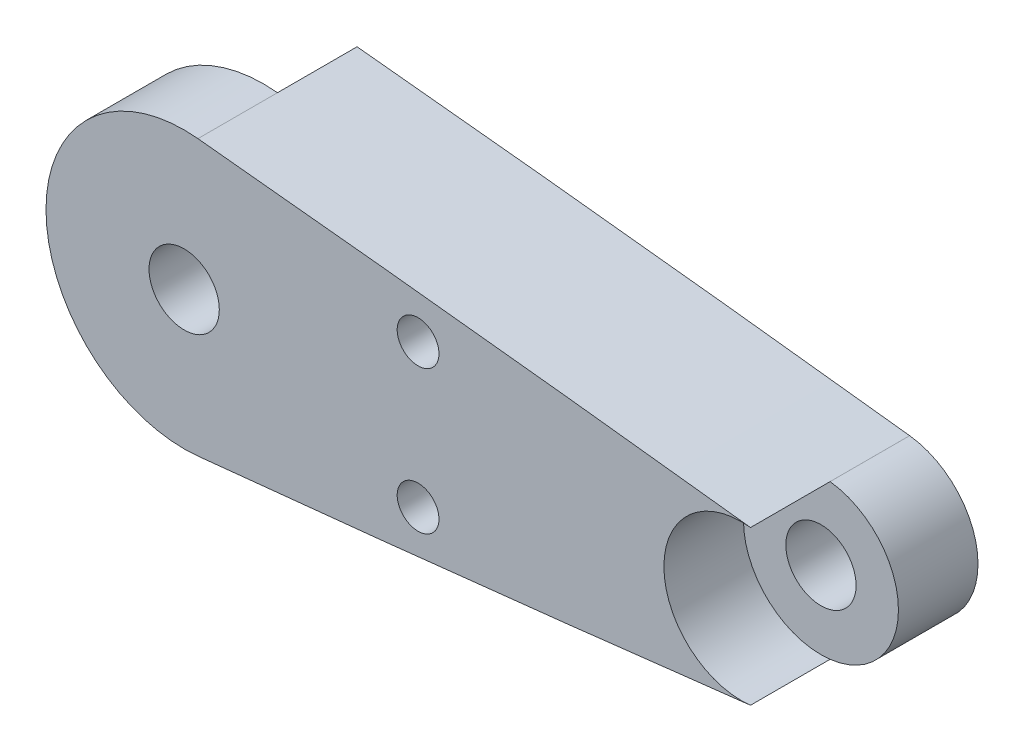
ISO-10303-21;
HEADER;
FILE_DESCRIPTION(('STEP AP214'),'2;1');
FILE_NAME('part.step','',(''),(''),'','','');
FILE_SCHEMA(('AUTOMOTIVE_DESIGN { 1 0 10303 214 1 1 1 1 }'));
ENDSEC;
DATA;
#1=APPLICATION_CONTEXT('core data for automotive mechanical design processes');
#2=APPLICATION_PROTOCOL_DEFINITION('international standard','automotive_design',2000,#1);
#3=PRODUCT_CONTEXT('',#1,'mechanical');
#4=PRODUCT('Part','Part','',(#3));
#5=PRODUCT_RELATED_PRODUCT_CATEGORY('part','',(#4));
#6=PRODUCT_DEFINITION_FORMATION('','',#4);
#7=PRODUCT_DEFINITION_CONTEXT('part definition',#1,'design');
#8=PRODUCT_DEFINITION('design','',#6,#7);
#9=PRODUCT_DEFINITION_SHAPE('','',#8);
#10=(LENGTH_UNIT() NAMED_UNIT(*) SI_UNIT(.MILLI.,.METRE.));
#11=(NAMED_UNIT(*) PLANE_ANGLE_UNIT() SI_UNIT($,.RADIAN.));
#12=(NAMED_UNIT(*) SI_UNIT($,.STERADIAN.) SOLID_ANGLE_UNIT());
#13=UNCERTAINTY_MEASURE_WITH_UNIT(LENGTH_MEASURE(1.E-05),#10,'distance_accuracy_value','');
#14=(GEOMETRIC_REPRESENTATION_CONTEXT(3) GLOBAL_UNCERTAINTY_ASSIGNED_CONTEXT((#13)) GLOBAL_UNIT_ASSIGNED_CONTEXT((#10,
#11,#12)) REPRESENTATION_CONTEXT('',''));
#15=CARTESIAN_POINT('',(0.,0.,0.));
#16=DIRECTION('',(0.,0.,1.));
#17=DIRECTION('',(1.,0.,0.));
#18=AXIS2_PLACEMENT_3D('',#15,#16,#17);
#19=CARTESIAN_POINT('',(215.289821858709,0.,12.));
#20=DIRECTION('',(0.,0.,-1.));
#21=DIRECTION('',(-1.,0.,0.));
#22=AXIS2_PLACEMENT_3D('',#19,#20,#21);
#23=CYLINDRICAL_SURFACE('',#22,2.65000000000001);
#24=CARTESIAN_POINT('',(215.289821858709,0.,12.));
#25=DIRECTION('',(0.,0.,1.));
#26=DIRECTION('',(1.,0.,0.));
#27=AXIS2_PLACEMENT_3D('',#24,#25,#26);
#28=CIRCLE('',#27,2.65000000000001);
#29=CARTESIAN_POINT('',(217.939821858709,0.,12.));
#30=VERTEX_POINT('',#29);
#31=EDGE_CURVE('E53',#30,#30,#28,.T.);
#32=ORIENTED_EDGE('',*,*,#31,.T.);
#33=EDGE_LOOP('',(#32));
#34=FACE_BOUND('',#33,.T.);
#35=CARTESIAN_POINT('',(215.289821858709,0.,6.));
#36=DIRECTION('',(0.,0.,1.));
#37=DIRECTION('',(1.,0.,0.));
#38=AXIS2_PLACEMENT_3D('',#35,#36,#37);
#39=CIRCLE('',#38,2.65000000000001);
#40=CARTESIAN_POINT('',(217.939821858709,0.,6.));
#41=VERTEX_POINT('',#40);
#42=EDGE_CURVE('E202',#41,#41,#39,.T.);
#43=ORIENTED_EDGE('',*,*,#42,.F.);
#44=EDGE_LOOP('',(#43));
#45=FACE_BOUND('',#44,.T.);
#46=ADVANCED_FACE('F44',(#34,#45),#23,.F.);
#47=CARTESIAN_POINT('',(215.289821858709,0.,12.));
#48=DIRECTION('',(0.,0.,-1.));
#49=DIRECTION('',(-1.,0.,0.));
#50=AXIS2_PLACEMENT_3D('',#47,#48,#49);
#51=CYLINDRICAL_SURFACE('',#50,10.4185907990476);
#52=DIRECTION('',(0.,0.,-1.));
#53=VECTOR('',#52,1.);
#54=CARTESIAN_POINT('',(216.328689217383,-10.3666672006523,12.));
#55=LINE('',#54,#53);
#56=CARTESIAN_POINT('',(216.328689217383,-10.3666672006523,12.));
#57=VERTEX_POINT('',#56);
#58=CARTESIAN_POINT('',(216.328689217383,-10.3666672006523,6.));
#59=VERTEX_POINT('',#58);
#60=EDGE_CURVE('E196',#57,#59,#55,.T.);
#61=ORIENTED_EDGE('',*,*,#60,.F.);
#62=CARTESIAN_POINT('',(215.289821858709,0.,12.));
#63=DIRECTION('',(0.,0.,1.));
#64=DIRECTION('',(1.,0.,0.));
#65=AXIS2_PLACEMENT_3D('',#62,#63,#64);
#66=CIRCLE('',#65,10.4185907990476);
#67=CARTESIAN_POINT('',(216.328689217383,10.3666672006523,12.));
#68=VERTEX_POINT('',#67);
#69=EDGE_CURVE('E11',#57,#68,#66,.F.);
#70=ORIENTED_EDGE('',*,*,#69,.T.);
#71=DIRECTION('',(0.,0.,-1.));
#72=VECTOR('',#71,1.);
#73=CARTESIAN_POINT('',(216.328689217383,10.3666672006523,12.));
#74=LINE('',#73,#72);
#75=CARTESIAN_POINT('',(216.328689217383,10.3666672006523,6.));
#76=VERTEX_POINT('',#75);
#77=EDGE_CURVE('E214',#68,#76,#74,.T.);
#78=ORIENTED_EDGE('',*,*,#77,.T.);
#79=CARTESIAN_POINT('',(215.289821858709,0.,6.));
#80=DIRECTION('',(0.,0.,1.));
#81=DIRECTION('',(1.,0.,0.));
#82=AXIS2_PLACEMENT_3D('',#79,#80,#81);
#83=CIRCLE('',#82,10.4185907990476);
#84=EDGE_CURVE('E47',#59,#76,#83,.F.);
#85=ORIENTED_EDGE('',*,*,#84,.F.);
#86=EDGE_LOOP('',(#61,#70,#78,#85));
#87=FACE_BOUND('',#86,.T.);
#88=ADVANCED_FACE('F183',(#87),#51,.T.);
#89=CARTESIAN_POINT('',(0.,0.,12.));
#90=DIRECTION('',(0.,0.,1.));
#91=DIRECTION('',(1.,0.,0.));
#92=AXIS2_PLACEMENT_3D('',#89,#90,#91);
#93=PLANE('',#92);
#94=CARTESIAN_POINT('',(232.929583796921,5.4,12.));
#95=DIRECTION('',(0.,0.,1.));
#96=DIRECTION('',(1.,0.,0.));
#97=AXIS2_PLACEMENT_3D('',#94,#95,#96);
#98=CIRCLE('',#97,1.57500000000001);
#99=CARTESIAN_POINT('',(234.504583796921,5.4,12.));
#100=VERTEX_POINT('',#99);
#101=EDGE_CURVE('E273',#100,#100,#98,.T.);
#102=ORIENTED_EDGE('',*,*,#101,.F.);
#103=EDGE_LOOP('',(#102));
#104=FACE_BOUND('',#103,.T.);
#105=CARTESIAN_POINT('',(232.929583796921,-5.4,12.));
#106=DIRECTION('',(0.,0.,1.));
#107=DIRECTION('',(1.,0.,0.));
#108=AXIS2_PLACEMENT_3D('',#105,#106,#107);
#109=CIRCLE('',#108,1.57500000000001);
#110=CARTESIAN_POINT('',(234.504583796921,-5.4,12.));
#111=VERTEX_POINT('',#110);
#112=EDGE_CURVE('E269',#111,#111,#109,.T.);
#113=ORIENTED_EDGE('',*,*,#112,.F.);
#114=EDGE_LOOP('',(#113));
#115=FACE_BOUND('',#114,.T.);
#116=ORIENTED_EDGE('',*,*,#31,.F.);
#117=EDGE_LOOP('',(#116));
#118=FACE_BOUND('',#117,.T.);
#119=ORIENTED_EDGE('',*,*,#69,.F.);
#120=CARTESIAN_POINT('',(300.,0.378,12.));
#121=CARTESIAN_POINT('',(299.845901447221,0.39961034336831,12.));
#122=CARTESIAN_POINT('',(299.230346714046,0.48593399083917,12.));
#123=CARTESIAN_POINT('',(297.848901683276,0.678531057447331,12.));
#124=CARTESIAN_POINT('',(295.556029122455,0.996787499241564,12.));
#125=CARTESIAN_POINT('',(292.365739581197,1.43343203295321,12.));
#126=CARTESIAN_POINT('',(288.297856433401,1.98344889126347,12.));
#127=CARTESIAN_POINT('',(283.377248038078,2.63572648359042,12.));
#128=CARTESIAN_POINT('',(277.63430498472,3.38149178862329,12.));
#129=CARTESIAN_POINT('',(271.104515413466,4.20901604095742,12.));
#130=CARTESIAN_POINT('',(263.828064626846,5.10718872872647,12.));
#131=CARTESIAN_POINT('',(255.849823781818,6.06276893212352,12.));
#132=CARTESIAN_POINT('',(247.21903434379,7.06424307195608,12.));
#133=CARTESIAN_POINT('',(237.988783489903,8.09787318806774,12.));
#134=CARTESIAN_POINT('',(228.216029511608,9.15107036010328,12.));
#135=CARTESIAN_POINT('',(217.961088379031,10.2107446574668,12.));
#136=CARTESIAN_POINT('',(207.287161839572,11.2632209265187,12.));
#137=CARTESIAN_POINT('',(196.260086850424,12.2937248064858,12.));
#138=CARTESIAN_POINT('',(184.947773044503,13.2887281219597,12.));
#139=CARTESIAN_POINT('',(173.420088229148,14.2315961384787,12.));
#140=CARTESIAN_POINT('',(161.747864995533,15.1069553720124,12.));
#141=CARTESIAN_POINT('',(150.00317252135,15.8985540753976,12.));
#142=CARTESIAN_POINT('',(138.258374542497,16.5898406039741,12.));
#143=CARTESIAN_POINT('',(126.585774705795,17.1633504747405,12.));
#144=CARTESIAN_POINT('',(115.057462615139,17.6037905135667,12.));
#145=CARTESIAN_POINT('',(103.744181572864,17.8967919128621,12.));
#146=CARTESIAN_POINT('',(92.7158453472272,18.0280433746414,12.));
#147=CARTESIAN_POINT('',(82.0402185013839,17.9871287273908,12.));
#148=CARTESIAN_POINT('',(71.7831190583338,17.7661449762132,12.));
#149=CARTESIAN_POINT('',(62.0076841473254,17.3594904245971,12.));
#150=CARTESIAN_POINT('',(52.7740834437817,16.7661013276277,12.));
#151=CARTESIAN_POINT('',(44.1390669938569,15.987763153894,12.));
#152=CARTESIAN_POINT('',(36.1554749512941,15.0305547578774,12.));
#153=CARTESIAN_POINT('',(28.8719698679608,13.9026205663682,12.));
#154=CARTESIAN_POINT('',(22.3326880228315,12.6157408879695,12.));
#155=CARTESIAN_POINT('',(16.5759570466198,11.1844668147641,12.));
#156=CARTESIAN_POINT('',(11.6344891822112,9.62275505380201,12.));
#157=CARTESIAN_POINT('',(7.53339032845527,7.94515078115887,12.));
#158=CARTESIAN_POINT('',(4.28573900369485,6.16300377839948,12.));
#159=CARTESIAN_POINT('',(1.8965325692393,4.27279663699588,12.));
#160=CARTESIAN_POINT('',(0.366265286449645,2.2288009510305,12.));
#161=CARTESIAN_POINT('',(-0.170692645797294,0.,12.));
#162=CARTESIAN_POINT('',(0.366265286449666,-2.22880095103055,12.));
#163=CARTESIAN_POINT('',(1.89653256923925,-4.27279663699582,12.));
#164=CARTESIAN_POINT('',(4.28573900369493,-6.16300377839955,12.));
#165=CARTESIAN_POINT('',(7.53339032845521,-7.94515078115883,12.));
#166=CARTESIAN_POINT('',(11.6344891822112,-9.62275505380201,12.));
#167=CARTESIAN_POINT('',(16.5759570466199,-11.1844668147641,12.));
#168=CARTESIAN_POINT('',(22.3326880228314,-12.6157408879695,12.));
#169=CARTESIAN_POINT('',(28.8719698679608,-13.9026205663682,12.));
#170=CARTESIAN_POINT('',(36.155474951294,-15.0305547578773,12.));
#171=CARTESIAN_POINT('',(44.1390669938569,-15.987763153894,12.));
#172=CARTESIAN_POINT('',(52.7740834437817,-16.7661013276277,12.));
#173=CARTESIAN_POINT('',(62.0076841473254,-17.3594904245971,12.));
#174=CARTESIAN_POINT('',(71.7831190583338,-17.7661449762132,12.));
#175=CARTESIAN_POINT('',(82.0402185013839,-17.9871287273908,12.));
#176=CARTESIAN_POINT('',(92.7158453472273,-18.0280433746414,12.));
#177=CARTESIAN_POINT('',(103.744181572864,-17.8967919128621,12.));
#178=CARTESIAN_POINT('',(115.057462615139,-17.6037905135667,12.));
#179=CARTESIAN_POINT('',(126.585774705795,-17.1633504747405,12.));
#180=CARTESIAN_POINT('',(138.258374542497,-16.5898406039741,12.));
#181=CARTESIAN_POINT('',(150.00317252135,-15.8985540753976,12.));
#182=CARTESIAN_POINT('',(161.747864995533,-15.1069553720124,12.));
#183=CARTESIAN_POINT('',(173.420088229148,-14.2315961384787,12.));
#184=CARTESIAN_POINT('',(184.947773044503,-13.2887281219597,12.));
#185=CARTESIAN_POINT('',(196.260086850424,-12.2937248064858,12.));
#186=CARTESIAN_POINT('',(207.287161839572,-11.2632209265187,12.));
#187=CARTESIAN_POINT('',(217.961088379031,-10.2107446574668,12.));
#188=CARTESIAN_POINT('',(228.216029511608,-9.15107036010328,12.));
#189=CARTESIAN_POINT('',(237.988783489903,-8.09787318806774,12.));
#190=CARTESIAN_POINT('',(247.21903434379,-7.06424307195608,12.));
#191=CARTESIAN_POINT('',(255.849823781818,-6.0627689321235,12.));
#192=CARTESIAN_POINT('',(263.828064626846,-5.10718872872648,12.));
#193=CARTESIAN_POINT('',(271.104515413466,-4.20901604095741,12.));
#194=CARTESIAN_POINT('',(277.63430498472,-3.38149178862329,12.));
#195=CARTESIAN_POINT('',(283.377248038078,-2.63572648359043,12.));
#196=CARTESIAN_POINT('',(288.297856433401,-1.98344889126346,12.));
#197=CARTESIAN_POINT('',(292.365739581198,-1.43343203295321,12.));
#198=CARTESIAN_POINT('',(295.556029122455,-0.996787499241567,12.));
#199=CARTESIAN_POINT('',(297.848901683276,-0.678531057447318,12.));
#200=CARTESIAN_POINT('',(299.230346714046,-0.48593399083919,12.));
#201=CARTESIAN_POINT('',(299.845901447221,-0.399610343368311,12.));
#202=CARTESIAN_POINT('',(300.,-0.378,12.));
#203=B_SPLINE_CURVE_WITH_KNOTS('',3,(#120,#121,#122,#123,#124,#125,#126,#127,#128,#129,#130,
#131,#132,#133,#134,#135,#136,#137,#138,#139,#140,#141,#142,#143,#144,#145,#146,#147,#148,#149,
#150,#151,#152,#153,#154,#155,#156,#157,#158,#159,#160,#161,#162,#163,#164,#165,#166,#167,#168,
#169,#170,#171,#172,#173,#174,#175,#176,#177,#178,#179,#180,#181,#182,#183,#184,#185,#186,#187,
#188,#189,#190,#191,#192,#193,#194,#195,#196,#197,#198,#199,#200,#201,#202),.UNSPECIFIED.,.F.,
.F.,(4,1,1,1,1,1,1,1,1,1,1,1,1,1,1,1,1,1,1,1,1,1,1,1,1,1,1,1,1,1,1,1,1,1,1,1,1,1,1,1,1,1,1,1,1,
1,1,1,1,1,1,1,1,1,1,1,1,1,1,1,1,1,1,1,1,1,1,1,1,1,1,1,1,1,1,1,1,1,1,1,4),(0.,
0.000763156679271448,0.00304846929193477,0.00684068957953669,0.0121161317605396,
0.0188407924276644,0.0269727495182071,0.0364598537113803,0.0472429445210447,0.0592535547279477,
0.0724172643119224,0.0866510217067198,0.101866322474926,0.117968955401192,0.134857918638583,
0.152428309483259,0.170571841082248,0.189174521814913,0.208122338288737,0.227296649324545,
0.246580070424687,0.265853108019993,0.284996761496293,0.303895241632262,0.322432580929281,
0.340498658943124,0.357984483489282,0.37478811429809,0.390812303248415,0.405965006366899,
0.420162443159487,0.433328264782086,0.445393603392471,0.456301171479378,0.466003880875037,
0.474472000637231,0.481696232103684,0.487703697963338,0.492583405321472,0.496543603187854,0.5,
0.503456396812145,0.507416594678528,0.512296302036662,0.518303767896316,0.525527999362769,
0.533996119124963,0.543698828520622,0.554606396607529,0.566671735217914,0.579837556840513,
0.594034993633101,0.609187696751585,0.62521188570191,0.642015516510718,0.659501341056876,
0.677567419070719,0.696104758367738,0.715003238503707,0.734146891980006,0.753419929575313,
0.772703350675454,0.791877661711263,0.810825478185087,0.829428158917752,0.847571690516741,
0.865142081361417,0.882031044598807,0.898133677525074,0.91334897829328,0.927582735688077,
0.940746445272052,0.952757055478955,0.96354014628862,0.973027250481793,0.981159207572336,
0.98788386823946,0.993159310420463,0.996951530708065,0.999236843320729,1.),.UNSPECIFIED.);
#204=CARTESIAN_POINT('',(257.998689197558,-5.80323205159229,12.));
#205=VERTEX_POINT('',#204);
#206=EDGE_CURVE('E156',#57,#205,#203,.T.);
#207=ORIENTED_EDGE('',*,*,#206,.T.);
#208=CARTESIAN_POINT('',(257.310289277962,0.,12.));
#209=DIRECTION('',(0.,0.,1.));
#210=DIRECTION('',(1.,0.,0.));
#211=AXIS2_PLACEMENT_3D('',#208,#209,#210);
#212=CIRCLE('',#211,5.8439196344516);
#213=CARTESIAN_POINT('',(257.998689197558,5.80323205159231,12.));
#214=VERTEX_POINT('',#213);
#215=EDGE_CURVE('E162',#205,#214,#212,.F.);
#216=ORIENTED_EDGE('',*,*,#215,.T.);
#217=CARTESIAN_POINT('',(300.,0.378,12.));
#218=CARTESIAN_POINT('',(299.845901447221,0.39961034336831,12.));
#219=CARTESIAN_POINT('',(299.230346714046,0.48593399083917,12.));
#220=CARTESIAN_POINT('',(297.848901683276,0.678531057447331,12.));
#221=CARTESIAN_POINT('',(295.556029122455,0.996787499241564,12.));
#222=CARTESIAN_POINT('',(292.365739581197,1.43343203295321,12.));
#223=CARTESIAN_POINT('',(288.297856433401,1.98344889126347,12.));
#224=CARTESIAN_POINT('',(283.377248038078,2.63572648359042,12.));
#225=CARTESIAN_POINT('',(277.63430498472,3.38149178862329,12.));
#226=CARTESIAN_POINT('',(271.104515413466,4.20901604095742,12.));
#227=CARTESIAN_POINT('',(263.828064626846,5.10718872872647,12.));
#228=CARTESIAN_POINT('',(255.849823781818,6.06276893212352,12.));
#229=CARTESIAN_POINT('',(247.21903434379,7.06424307195608,12.));
#230=CARTESIAN_POINT('',(237.988783489903,8.09787318806774,12.));
#231=CARTESIAN_POINT('',(228.216029511608,9.15107036010328,12.));
#232=CARTESIAN_POINT('',(217.961088379031,10.2107446574668,12.));
#233=CARTESIAN_POINT('',(207.287161839572,11.2632209265187,12.));
#234=CARTESIAN_POINT('',(196.260086850424,12.2937248064858,12.));
#235=CARTESIAN_POINT('',(184.947773044503,13.2887281219597,12.));
#236=CARTESIAN_POINT('',(173.420088229148,14.2315961384787,12.));
#237=CARTESIAN_POINT('',(161.747864995533,15.1069553720124,12.));
#238=CARTESIAN_POINT('',(150.00317252135,15.8985540753976,12.));
#239=CARTESIAN_POINT('',(138.258374542497,16.5898406039741,12.));
#240=CARTESIAN_POINT('',(126.585774705795,17.1633504747405,12.));
#241=CARTESIAN_POINT('',(115.057462615139,17.6037905135667,12.));
#242=CARTESIAN_POINT('',(103.744181572864,17.8967919128621,12.));
#243=CARTESIAN_POINT('',(92.7158453472272,18.0280433746414,12.));
#244=CARTESIAN_POINT('',(82.0402185013839,17.9871287273908,12.));
#245=CARTESIAN_POINT('',(71.7831190583338,17.7661449762132,12.));
#246=CARTESIAN_POINT('',(62.0076841473254,17.3594904245971,12.));
#247=CARTESIAN_POINT('',(52.7740834437817,16.7661013276277,12.));
#248=CARTESIAN_POINT('',(44.1390669938569,15.987763153894,12.));
#249=CARTESIAN_POINT('',(36.1554749512941,15.0305547578774,12.));
#250=CARTESIAN_POINT('',(28.8719698679608,13.9026205663682,12.));
#251=CARTESIAN_POINT('',(22.3326880228315,12.6157408879695,12.));
#252=CARTESIAN_POINT('',(16.5759570466198,11.1844668147641,12.));
#253=CARTESIAN_POINT('',(11.6344891822112,9.62275505380201,12.));
#254=CARTESIAN_POINT('',(7.53339032845527,7.94515078115887,12.));
#255=CARTESIAN_POINT('',(4.28573900369485,6.16300377839948,12.));
#256=CARTESIAN_POINT('',(1.8965325692393,4.27279663699588,12.));
#257=CARTESIAN_POINT('',(0.366265286449645,2.2288009510305,12.));
#258=CARTESIAN_POINT('',(-0.170692645797294,0.,12.));
#259=CARTESIAN_POINT('',(0.366265286449666,-2.22880095103055,12.));
#260=CARTESIAN_POINT('',(1.89653256923925,-4.27279663699582,12.));
#261=CARTESIAN_POINT('',(4.28573900369493,-6.16300377839955,12.));
#262=CARTESIAN_POINT('',(7.53339032845521,-7.94515078115883,12.));
#263=CARTESIAN_POINT('',(11.6344891822112,-9.62275505380201,12.));
#264=CARTESIAN_POINT('',(16.5759570466199,-11.1844668147641,12.));
#265=CARTESIAN_POINT('',(22.3326880228314,-12.6157408879695,12.));
#266=CARTESIAN_POINT('',(28.8719698679608,-13.9026205663682,12.));
#267=CARTESIAN_POINT('',(36.155474951294,-15.0305547578773,12.));
#268=CARTESIAN_POINT('',(44.1390669938569,-15.987763153894,12.));
#269=CARTESIAN_POINT('',(52.7740834437817,-16.7661013276277,12.));
#270=CARTESIAN_POINT('',(62.0076841473254,-17.3594904245971,12.));
#271=CARTESIAN_POINT('',(71.7831190583338,-17.7661449762132,12.));
#272=CARTESIAN_POINT('',(82.0402185013839,-17.9871287273908,12.));
#273=CARTESIAN_POINT('',(92.7158453472273,-18.0280433746414,12.));
#274=CARTESIAN_POINT('',(103.744181572864,-17.8967919128621,12.));
#275=CARTESIAN_POINT('',(115.057462615139,-17.6037905135667,12.));
#276=CARTESIAN_POINT('',(126.585774705795,-17.1633504747405,12.));
#277=CARTESIAN_POINT('',(138.258374542497,-16.5898406039741,12.));
#278=CARTESIAN_POINT('',(150.00317252135,-15.8985540753976,12.));
#279=CARTESIAN_POINT('',(161.747864995533,-15.1069553720124,12.));
#280=CARTESIAN_POINT('',(173.420088229148,-14.2315961384787,12.));
#281=CARTESIAN_POINT('',(184.947773044503,-13.2887281219597,12.));
#282=CARTESIAN_POINT('',(196.260086850424,-12.2937248064858,12.));
#283=CARTESIAN_POINT('',(207.287161839572,-11.2632209265187,12.));
#284=CARTESIAN_POINT('',(217.961088379031,-10.2107446574668,12.));
#285=CARTESIAN_POINT('',(228.216029511608,-9.15107036010328,12.));
#286=CARTESIAN_POINT('',(237.988783489903,-8.09787318806774,12.));
#287=CARTESIAN_POINT('',(247.21903434379,-7.06424307195608,12.));
#288=CARTESIAN_POINT('',(255.849823781818,-6.0627689321235,12.));
#289=CARTESIAN_POINT('',(263.828064626846,-5.10718872872648,12.));
#290=CARTESIAN_POINT('',(271.104515413466,-4.20901604095741,12.));
#291=CARTESIAN_POINT('',(277.63430498472,-3.38149178862329,12.));
#292=CARTESIAN_POINT('',(283.377248038078,-2.63572648359043,12.));
#293=CARTESIAN_POINT('',(288.297856433401,-1.98344889126346,12.));
#294=CARTESIAN_POINT('',(292.365739581198,-1.43343203295321,12.));
#295=CARTESIAN_POINT('',(295.556029122455,-0.996787499241567,12.));
#296=CARTESIAN_POINT('',(297.848901683276,-0.678531057447318,12.));
#297=CARTESIAN_POINT('',(299.230346714046,-0.48593399083919,12.));
#298=CARTESIAN_POINT('',(299.845901447221,-0.399610343368311,12.));
#299=CARTESIAN_POINT('',(300.,-0.378,12.));
#300=B_SPLINE_CURVE_WITH_KNOTS('',3,(#217,#218,#219,#220,#221,#222,#223,#224,#225,#226,#227,
#228,#229,#230,#231,#232,#233,#234,#235,#236,#237,#238,#239,#240,#241,#242,#243,#244,#245,#246,
#247,#248,#249,#250,#251,#252,#253,#254,#255,#256,#257,#258,#259,#260,#261,#262,#263,#264,#265,
#266,#267,#268,#269,#270,#271,#272,#273,#274,#275,#276,#277,#278,#279,#280,#281,#282,#283,#284,
#285,#286,#287,#288,#289,#290,#291,#292,#293,#294,#295,#296,#297,#298,#299),.UNSPECIFIED.,.F.,
.F.,(4,1,1,1,1,1,1,1,1,1,1,1,1,1,1,1,1,1,1,1,1,1,1,1,1,1,1,1,1,1,1,1,1,1,1,1,1,1,1,1,1,1,1,1,1,
1,1,1,1,1,1,1,1,1,1,1,1,1,1,1,1,1,1,1,1,1,1,1,1,1,1,1,1,1,1,1,1,1,1,1,4),(0.,
0.000763156679271448,0.00304846929193477,0.00684068957953669,0.0121161317605396,
0.0188407924276644,0.0269727495182071,0.0364598537113803,0.0472429445210447,0.0592535547279477,
0.0724172643119224,0.0866510217067198,0.101866322474926,0.117968955401192,0.134857918638583,
0.152428309483259,0.170571841082248,0.189174521814913,0.208122338288737,0.227296649324545,
0.246580070424687,0.265853108019993,0.284996761496293,0.303895241632262,0.322432580929281,
0.340498658943124,0.357984483489282,0.37478811429809,0.390812303248415,0.405965006366899,
0.420162443159487,0.433328264782086,0.445393603392471,0.456301171479378,0.466003880875037,
0.474472000637231,0.481696232103684,0.487703697963338,0.492583405321472,0.496543603187854,0.5,
0.503456396812145,0.507416594678528,0.512296302036662,0.518303767896316,0.525527999362769,
0.533996119124963,0.543698828520622,0.554606396607529,0.566671735217914,0.579837556840513,
0.594034993633101,0.609187696751585,0.62521188570191,0.642015516510718,0.659501341056876,
0.677567419070719,0.696104758367738,0.715003238503707,0.734146891980006,0.753419929575313,
0.772703350675454,0.791877661711263,0.810825478185087,0.829428158917752,0.847571690516741,
0.865142081361417,0.882031044598807,0.898133677525074,0.91334897829328,0.927582735688077,
0.940746445272052,0.952757055478955,0.96354014628862,0.973027250481793,0.981159207572336,
0.98788386823946,0.993159310420463,0.996951530708065,0.999236843320729,1.),.UNSPECIFIED.);
#301=EDGE_CURVE('E207',#214,#68,#300,.T.);
#302=ORIENTED_EDGE('',*,*,#301,.T.);
#303=EDGE_LOOP('',(#119,#207,#216,#302));
#304=FACE_BOUND('',#303,.T.);
#305=ADVANCED_FACE('F180',(#104,#115,#118,#304),#93,.T.);
#306=CARTESIAN_POINT('',(0.,0.,6.));
#307=DIRECTION('',(0.,0.,1.));
#308=DIRECTION('',(1.,0.,0.));
#309=AXIS2_PLACEMENT_3D('',#306,#307,#308);
#310=PLANE('',#309);
#311=ORIENTED_EDGE('',*,*,#42,.T.);
#312=EDGE_LOOP('',(#311));
#313=FACE_BOUND('',#312,.T.);
#314=ORIENTED_EDGE('',*,*,#84,.T.);
#315=EDGE_CURVE('E238',#76,#59,#83,.F.);
#316=ORIENTED_EDGE('',*,*,#315,.T.);
#317=EDGE_LOOP('',(#314,#316));
#318=FACE_BOUND('',#317,.T.);
#319=ADVANCED_FACE('F178',(#313,#318),#310,.F.);
#320=CARTESIAN_POINT('',(215.289821858709,0.,12.));
#321=DIRECTION('',(0.,0.,-1.));
#322=DIRECTION('',(-1.,0.,0.));
#323=AXIS2_PLACEMENT_3D('',#320,#321,#322);
#324=CYLINDRICAL_SURFACE('',#323,10.4185907990476);
#325=CARTESIAN_POINT('',(216.328689217383,-10.3666672006523,0.));
#326=VERTEX_POINT('',#325);
#327=EDGE_CURVE('E203',#59,#326,#55,.T.);
#328=ORIENTED_EDGE('',*,*,#327,.F.);
#329=ORIENTED_EDGE('',*,*,#315,.F.);
#330=CARTESIAN_POINT('',(216.328689217383,10.3666672006523,0.));
#331=VERTEX_POINT('',#330);
#332=EDGE_CURVE('E212',#76,#331,#74,.T.);
#333=ORIENTED_EDGE('',*,*,#332,.T.);
#334=CARTESIAN_POINT('',(215.289821858709,0.,0.));
#335=DIRECTION('',(0.,0.,1.));
#336=DIRECTION('',(1.,0.,0.));
#337=AXIS2_PLACEMENT_3D('',#334,#335,#336);
#338=CIRCLE('',#337,10.4185907990476);
#339=EDGE_CURVE('E124',#331,#326,#338,.F.);
#340=ORIENTED_EDGE('',*,*,#339,.T.);
#341=EDGE_LOOP('',(#328,#329,#333,#340));
#342=FACE_BOUND('',#341,.T.);
#343=ADVANCED_FACE('F174',(#342),#324,.F.);
#344=DIRECTION('',(0.,0.,-1.));
#345=VECTOR('',#344,1.);
#346=SURFACE_OF_LINEAR_EXTRUSION('',#203,#345);
#347=CARTESIAN_POINT('',(300.,0.378,0.));
#348=CARTESIAN_POINT('',(299.845901447221,0.39961034336831,0.));
#349=CARTESIAN_POINT('',(299.230346714046,0.48593399083917,0.));
#350=CARTESIAN_POINT('',(297.848901683276,0.678531057447331,0.));
#351=CARTESIAN_POINT('',(295.556029122455,0.996787499241564,0.));
#352=CARTESIAN_POINT('',(292.365739581197,1.43343203295321,0.));
#353=CARTESIAN_POINT('',(288.297856433401,1.98344889126347,0.));
#354=CARTESIAN_POINT('',(283.377248038078,2.63572648359042,0.));
#355=CARTESIAN_POINT('',(277.63430498472,3.38149178862329,0.));
#356=CARTESIAN_POINT('',(271.104515413466,4.20901604095742,0.));
#357=CARTESIAN_POINT('',(263.828064626846,5.10718872872647,0.));
#358=CARTESIAN_POINT('',(255.849823781818,6.06276893212352,0.));
#359=CARTESIAN_POINT('',(247.21903434379,7.06424307195608,0.));
#360=CARTESIAN_POINT('',(237.988783489903,8.09787318806774,0.));
#361=CARTESIAN_POINT('',(228.216029511608,9.15107036010328,0.));
#362=CARTESIAN_POINT('',(217.961088379031,10.2107446574668,0.));
#363=CARTESIAN_POINT('',(207.287161839572,11.2632209265187,0.));
#364=CARTESIAN_POINT('',(196.260086850424,12.2937248064858,0.));
#365=CARTESIAN_POINT('',(184.947773044503,13.2887281219597,0.));
#366=CARTESIAN_POINT('',(173.420088229148,14.2315961384787,0.));
#367=CARTESIAN_POINT('',(161.747864995533,15.1069553720124,0.));
#368=CARTESIAN_POINT('',(150.00317252135,15.8985540753976,0.));
#369=CARTESIAN_POINT('',(138.258374542497,16.5898406039741,0.));
#370=CARTESIAN_POINT('',(126.585774705795,17.1633504747405,0.));
#371=CARTESIAN_POINT('',(115.057462615139,17.6037905135667,0.));
#372=CARTESIAN_POINT('',(103.744181572864,17.8967919128621,0.));
#373=CARTESIAN_POINT('',(92.7158453472272,18.0280433746414,0.));
#374=CARTESIAN_POINT('',(82.0402185013839,17.9871287273908,0.));
#375=CARTESIAN_POINT('',(71.7831190583338,17.7661449762132,0.));
#376=CARTESIAN_POINT('',(62.0076841473254,17.3594904245971,0.));
#377=CARTESIAN_POINT('',(52.7740834437817,16.7661013276277,0.));
#378=CARTESIAN_POINT('',(44.1390669938569,15.987763153894,0.));
#379=CARTESIAN_POINT('',(36.1554749512941,15.0305547578774,0.));
#380=CARTESIAN_POINT('',(28.8719698679608,13.9026205663682,0.));
#381=CARTESIAN_POINT('',(22.3326880228315,12.6157408879695,0.));
#382=CARTESIAN_POINT('',(16.5759570466198,11.1844668147641,0.));
#383=CARTESIAN_POINT('',(11.6344891822112,9.62275505380201,0.));
#384=CARTESIAN_POINT('',(7.53339032845527,7.94515078115887,0.));
#385=CARTESIAN_POINT('',(4.28573900369485,6.16300377839948,0.));
#386=CARTESIAN_POINT('',(1.8965325692393,4.27279663699588,0.));
#387=CARTESIAN_POINT('',(0.366265286449645,2.2288009510305,0.));
#388=CARTESIAN_POINT('',(-0.170692645797294,0.,0.));
#389=CARTESIAN_POINT('',(0.366265286449666,-2.22880095103055,0.));
#390=CARTESIAN_POINT('',(1.89653256923925,-4.27279663699582,0.));
#391=CARTESIAN_POINT('',(4.28573900369493,-6.16300377839955,0.));
#392=CARTESIAN_POINT('',(7.53339032845521,-7.94515078115883,0.));
#393=CARTESIAN_POINT('',(11.6344891822112,-9.62275505380201,0.));
#394=CARTESIAN_POINT('',(16.5759570466199,-11.1844668147641,0.));
#395=CARTESIAN_POINT('',(22.3326880228314,-12.6157408879695,0.));
#396=CARTESIAN_POINT('',(28.8719698679608,-13.9026205663682,0.));
#397=CARTESIAN_POINT('',(36.155474951294,-15.0305547578773,0.));
#398=CARTESIAN_POINT('',(44.1390669938569,-15.987763153894,0.));
#399=CARTESIAN_POINT('',(52.7740834437817,-16.7661013276277,0.));
#400=CARTESIAN_POINT('',(62.0076841473254,-17.3594904245971,0.));
#401=CARTESIAN_POINT('',(71.7831190583338,-17.7661449762132,0.));
#402=CARTESIAN_POINT('',(82.0402185013839,-17.9871287273908,0.));
#403=CARTESIAN_POINT('',(92.7158453472273,-18.0280433746414,0.));
#404=CARTESIAN_POINT('',(103.744181572864,-17.8967919128621,0.));
#405=CARTESIAN_POINT('',(115.057462615139,-17.6037905135667,0.));
#406=CARTESIAN_POINT('',(126.585774705795,-17.1633504747405,0.));
#407=CARTESIAN_POINT('',(138.258374542497,-16.5898406039741,0.));
#408=CARTESIAN_POINT('',(150.00317252135,-15.8985540753976,0.));
#409=CARTESIAN_POINT('',(161.747864995533,-15.1069553720124,0.));
#410=CARTESIAN_POINT('',(173.420088229148,-14.2315961384787,0.));
#411=CARTESIAN_POINT('',(184.947773044503,-13.2887281219597,0.));
#412=CARTESIAN_POINT('',(196.260086850424,-12.2937248064858,0.));
#413=CARTESIAN_POINT('',(207.287161839572,-11.2632209265187,0.));
#414=CARTESIAN_POINT('',(217.961088379031,-10.2107446574668,0.));
#415=CARTESIAN_POINT('',(228.216029511608,-9.15107036010328,0.));
#416=CARTESIAN_POINT('',(237.988783489903,-8.09787318806774,0.));
#417=CARTESIAN_POINT('',(247.21903434379,-7.06424307195608,0.));
#418=CARTESIAN_POINT('',(255.849823781818,-6.0627689321235,0.));
#419=CARTESIAN_POINT('',(263.828064626846,-5.10718872872648,0.));
#420=CARTESIAN_POINT('',(271.104515413466,-4.20901604095741,0.));
#421=CARTESIAN_POINT('',(277.63430498472,-3.38149178862329,0.));
#422=CARTESIAN_POINT('',(283.377248038078,-2.63572648359043,0.));
#423=CARTESIAN_POINT('',(288.297856433401,-1.98344889126346,0.));
#424=CARTESIAN_POINT('',(292.365739581198,-1.43343203295321,0.));
#425=CARTESIAN_POINT('',(295.556029122455,-0.996787499241567,0.));
#426=CARTESIAN_POINT('',(297.848901683276,-0.678531057447318,0.));
#427=CARTESIAN_POINT('',(299.230346714046,-0.48593399083919,0.));
#428=CARTESIAN_POINT('',(299.845901447221,-0.399610343368311,0.));
#429=CARTESIAN_POINT('',(300.,-0.378,0.));
#430=B_SPLINE_CURVE_WITH_KNOTS('',3,(#347,#348,#349,#350,#351,#352,#353,#354,#355,#356,#357,
#358,#359,#360,#361,#362,#363,#364,#365,#366,#367,#368,#369,#370,#371,#372,#373,#374,#375,#376,
#377,#378,#379,#380,#381,#382,#383,#384,#385,#386,#387,#388,#389,#390,#391,#392,#393,#394,#395,
#396,#397,#398,#399,#400,#401,#402,#403,#404,#405,#406,#407,#408,#409,#410,#411,#412,#413,#414,
#415,#416,#417,#418,#419,#420,#421,#422,#423,#424,#425,#426,#427,#428,#429),.UNSPECIFIED.,.F.,
.F.,(4,1,1,1,1,1,1,1,1,1,1,1,1,1,1,1,1,1,1,1,1,1,1,1,1,1,1,1,1,1,1,1,1,1,1,1,1,1,1,1,1,1,1,1,1,
1,1,1,1,1,1,1,1,1,1,1,1,1,1,1,1,1,1,1,1,1,1,1,1,1,1,1,1,1,1,1,1,1,1,1,4),(0.,
0.000763156679271448,0.00304846929193477,0.00684068957953669,0.0121161317605396,
0.0188407924276644,0.0269727495182071,0.0364598537113803,0.0472429445210447,0.0592535547279477,
0.0724172643119224,0.0866510217067198,0.101866322474926,0.117968955401192,0.134857918638583,
0.152428309483259,0.170571841082248,0.189174521814913,0.208122338288737,0.227296649324545,
0.246580070424687,0.265853108019993,0.284996761496293,0.303895241632262,0.322432580929281,
0.340498658943124,0.357984483489282,0.37478811429809,0.390812303248415,0.405965006366899,
0.420162443159487,0.433328264782086,0.445393603392471,0.456301171479378,0.466003880875037,
0.474472000637231,0.481696232103684,0.487703697963338,0.492583405321472,0.496543603187854,0.5,
0.503456396812145,0.507416594678528,0.512296302036662,0.518303767896316,0.525527999362769,
0.533996119124963,0.543698828520622,0.554606396607529,0.566671735217914,0.579837556840513,
0.594034993633101,0.609187696751585,0.62521188570191,0.642015516510718,0.659501341056876,
0.677567419070719,0.696104758367738,0.715003238503707,0.734146891980006,0.753419929575313,
0.772703350675454,0.791877661711263,0.810825478185087,0.829428158917752,0.847571690516741,
0.865142081361417,0.882031044598807,0.898133677525074,0.91334897829328,0.927582735688077,
0.940746445272052,0.952757055478955,0.96354014628862,0.973027250481793,0.981159207572336,
0.98788386823946,0.993159310420463,0.996951530708065,0.999236843320729,1.),.UNSPECIFIED.);
#431=CARTESIAN_POINT('',(257.998689197558,-5.80323205159229,0.));
#432=VERTEX_POINT('',#431);
#433=EDGE_CURVE('E252',#326,#432,#430,.T.);
#434=ORIENTED_EDGE('',*,*,#433,.T.);
#435=DIRECTION('',(0.,0.,-1.));
#436=VECTOR('',#435,1.);
#437=CARTESIAN_POINT('',(257.998689197558,-5.80323205159229,12.));
#438=LINE('',#437,#436);
#439=CARTESIAN_POINT('',(257.998689197558,-5.80323205159229,6.));
#440=VERTEX_POINT('',#439);
#441=EDGE_CURVE('E61',#440,#432,#438,.T.);
#442=ORIENTED_EDGE('',*,*,#441,.F.);
#443=EDGE_CURVE('E231',#205,#440,#438,.T.);
#444=ORIENTED_EDGE('',*,*,#443,.F.);
#445=ORIENTED_EDGE('',*,*,#206,.F.);
#446=ORIENTED_EDGE('',*,*,#60,.T.);
#447=ORIENTED_EDGE('',*,*,#327,.T.);
#448=EDGE_LOOP('',(#434,#442,#444,#445,#446,#447));
#449=FACE_BOUND('',#448,.T.);
#450=ADVANCED_FACE('F169',(#449),#346,.F.);
#451=CARTESIAN_POINT('',(257.310289277962,0.,12.));
#452=DIRECTION('',(0.,0.,-1.));
#453=DIRECTION('',(-1.,0.,0.));
#454=AXIS2_PLACEMENT_3D('',#451,#452,#453);
#455=CYLINDRICAL_SURFACE('',#454,5.8439196344516);
#456=ORIENTED_EDGE('',*,*,#443,.T.);
#457=CARTESIAN_POINT('',(257.310289277962,0.,6.));
#458=DIRECTION('',(0.,0.,1.));
#459=DIRECTION('',(1.,0.,0.));
#460=AXIS2_PLACEMENT_3D('',#457,#458,#459);
#461=CIRCLE('',#460,5.8439196344516);
#462=CARTESIAN_POINT('',(257.998689197558,5.80323205159231,6.));
#463=VERTEX_POINT('',#462);
#464=EDGE_CURVE('E68',#440,#463,#461,.F.);
#465=ORIENTED_EDGE('',*,*,#464,.T.);
#466=DIRECTION('',(0.,0.,-1.));
#467=VECTOR('',#466,1.);
#468=CARTESIAN_POINT('',(257.998689197558,5.80323205159231,12.));
#469=LINE('',#468,#467);
#470=EDGE_CURVE('E223',#214,#463,#469,.T.);
#471=ORIENTED_EDGE('',*,*,#470,.F.);
#472=ORIENTED_EDGE('',*,*,#215,.F.);
#473=EDGE_LOOP('',(#456,#465,#471,#472));
#474=FACE_BOUND('',#473,.T.);
#475=ADVANCED_FACE('F173',(#474),#455,.F.);
#476=DIRECTION('',(0.,0.,-1.));
#477=VECTOR('',#476,1.);
#478=SURFACE_OF_LINEAR_EXTRUSION('',#300,#477);
#479=CARTESIAN_POINT('',(300.,0.378,0.));
#480=CARTESIAN_POINT('',(299.845901447221,0.39961034336831,0.));
#481=CARTESIAN_POINT('',(299.230346714046,0.48593399083917,0.));
#482=CARTESIAN_POINT('',(297.848901683276,0.678531057447331,0.));
#483=CARTESIAN_POINT('',(295.556029122455,0.996787499241564,0.));
#484=CARTESIAN_POINT('',(292.365739581197,1.43343203295321,0.));
#485=CARTESIAN_POINT('',(288.297856433401,1.98344889126347,0.));
#486=CARTESIAN_POINT('',(283.377248038078,2.63572648359042,0.));
#487=CARTESIAN_POINT('',(277.63430498472,3.38149178862329,0.));
#488=CARTESIAN_POINT('',(271.104515413466,4.20901604095742,0.));
#489=CARTESIAN_POINT('',(263.828064626846,5.10718872872647,0.));
#490=CARTESIAN_POINT('',(255.849823781818,6.06276893212352,0.));
#491=CARTESIAN_POINT('',(247.21903434379,7.06424307195608,0.));
#492=CARTESIAN_POINT('',(237.988783489903,8.09787318806774,0.));
#493=CARTESIAN_POINT('',(228.216029511608,9.15107036010328,0.));
#494=CARTESIAN_POINT('',(217.961088379031,10.2107446574668,0.));
#495=CARTESIAN_POINT('',(207.287161839572,11.2632209265187,0.));
#496=CARTESIAN_POINT('',(196.260086850424,12.2937248064858,0.));
#497=CARTESIAN_POINT('',(184.947773044503,13.2887281219597,0.));
#498=CARTESIAN_POINT('',(173.420088229148,14.2315961384787,0.));
#499=CARTESIAN_POINT('',(161.747864995533,15.1069553720124,0.));
#500=CARTESIAN_POINT('',(150.00317252135,15.8985540753976,0.));
#501=CARTESIAN_POINT('',(138.258374542497,16.5898406039741,0.));
#502=CARTESIAN_POINT('',(126.585774705795,17.1633504747405,0.));
#503=CARTESIAN_POINT('',(115.057462615139,17.6037905135667,0.));
#504=CARTESIAN_POINT('',(103.744181572864,17.8967919128621,0.));
#505=CARTESIAN_POINT('',(92.7158453472272,18.0280433746414,0.));
#506=CARTESIAN_POINT('',(82.0402185013839,17.9871287273908,0.));
#507=CARTESIAN_POINT('',(71.7831190583338,17.7661449762132,0.));
#508=CARTESIAN_POINT('',(62.0076841473254,17.3594904245971,0.));
#509=CARTESIAN_POINT('',(52.7740834437817,16.7661013276277,0.));
#510=CARTESIAN_POINT('',(44.1390669938569,15.987763153894,0.));
#511=CARTESIAN_POINT('',(36.1554749512941,15.0305547578774,0.));
#512=CARTESIAN_POINT('',(28.8719698679608,13.9026205663682,0.));
#513=CARTESIAN_POINT('',(22.3326880228315,12.6157408879695,0.));
#514=CARTESIAN_POINT('',(16.5759570466198,11.1844668147641,0.));
#515=CARTESIAN_POINT('',(11.6344891822112,9.62275505380201,0.));
#516=CARTESIAN_POINT('',(7.53339032845527,7.94515078115887,0.));
#517=CARTESIAN_POINT('',(4.28573900369485,6.16300377839948,0.));
#518=CARTESIAN_POINT('',(1.8965325692393,4.27279663699588,0.));
#519=CARTESIAN_POINT('',(0.366265286449645,2.2288009510305,0.));
#520=CARTESIAN_POINT('',(-0.170692645797294,0.,0.));
#521=CARTESIAN_POINT('',(0.366265286449666,-2.22880095103055,0.));
#522=CARTESIAN_POINT('',(1.89653256923925,-4.27279663699582,0.));
#523=CARTESIAN_POINT('',(4.28573900369493,-6.16300377839955,0.));
#524=CARTESIAN_POINT('',(7.53339032845521,-7.94515078115883,0.));
#525=CARTESIAN_POINT('',(11.6344891822112,-9.62275505380201,0.));
#526=CARTESIAN_POINT('',(16.5759570466199,-11.1844668147641,0.));
#527=CARTESIAN_POINT('',(22.3326880228314,-12.6157408879695,0.));
#528=CARTESIAN_POINT('',(28.8719698679608,-13.9026205663682,0.));
#529=CARTESIAN_POINT('',(36.155474951294,-15.0305547578773,0.));
#530=CARTESIAN_POINT('',(44.1390669938569,-15.987763153894,0.));
#531=CARTESIAN_POINT('',(52.7740834437817,-16.7661013276277,0.));
#532=CARTESIAN_POINT('',(62.0076841473254,-17.3594904245971,0.));
#533=CARTESIAN_POINT('',(71.7831190583338,-17.7661449762132,0.));
#534=CARTESIAN_POINT('',(82.0402185013839,-17.9871287273908,0.));
#535=CARTESIAN_POINT('',(92.7158453472273,-18.0280433746414,0.));
#536=CARTESIAN_POINT('',(103.744181572864,-17.8967919128621,0.));
#537=CARTESIAN_POINT('',(115.057462615139,-17.6037905135667,0.));
#538=CARTESIAN_POINT('',(126.585774705795,-17.1633504747405,0.));
#539=CARTESIAN_POINT('',(138.258374542497,-16.5898406039741,0.));
#540=CARTESIAN_POINT('',(150.00317252135,-15.8985540753976,0.));
#541=CARTESIAN_POINT('',(161.747864995533,-15.1069553720124,0.));
#542=CARTESIAN_POINT('',(173.420088229148,-14.2315961384787,0.));
#543=CARTESIAN_POINT('',(184.947773044503,-13.2887281219597,0.));
#544=CARTESIAN_POINT('',(196.260086850424,-12.2937248064858,0.));
#545=CARTESIAN_POINT('',(207.287161839572,-11.2632209265187,0.));
#546=CARTESIAN_POINT('',(217.961088379031,-10.2107446574668,0.));
#547=CARTESIAN_POINT('',(228.216029511608,-9.15107036010328,0.));
#548=CARTESIAN_POINT('',(237.988783489903,-8.09787318806774,0.));
#549=CARTESIAN_POINT('',(247.21903434379,-7.06424307195608,0.));
#550=CARTESIAN_POINT('',(255.849823781818,-6.0627689321235,0.));
#551=CARTESIAN_POINT('',(263.828064626846,-5.10718872872648,0.));
#552=CARTESIAN_POINT('',(271.104515413466,-4.20901604095741,0.));
#553=CARTESIAN_POINT('',(277.63430498472,-3.38149178862329,0.));
#554=CARTESIAN_POINT('',(283.377248038078,-2.63572648359043,0.));
#555=CARTESIAN_POINT('',(288.297856433401,-1.98344889126346,0.));
#556=CARTESIAN_POINT('',(292.365739581198,-1.43343203295321,0.));
#557=CARTESIAN_POINT('',(295.556029122455,-0.996787499241567,0.));
#558=CARTESIAN_POINT('',(297.848901683276,-0.678531057447318,0.));
#559=CARTESIAN_POINT('',(299.230346714046,-0.48593399083919,0.));
#560=CARTESIAN_POINT('',(299.845901447221,-0.399610343368311,0.));
#561=CARTESIAN_POINT('',(300.,-0.378,0.));
#562=B_SPLINE_CURVE_WITH_KNOTS('',3,(#479,#480,#481,#482,#483,#484,#485,#486,#487,#488,#489,
#490,#491,#492,#493,#494,#495,#496,#497,#498,#499,#500,#501,#502,#503,#504,#505,#506,#507,#508,
#509,#510,#511,#512,#513,#514,#515,#516,#517,#518,#519,#520,#521,#522,#523,#524,#525,#526,#527,
#528,#529,#530,#531,#532,#533,#534,#535,#536,#537,#538,#539,#540,#541,#542,#543,#544,#545,#546,
#547,#548,#549,#550,#551,#552,#553,#554,#555,#556,#557,#558,#559,#560,#561),.UNSPECIFIED.,.F.,
.F.,(4,1,1,1,1,1,1,1,1,1,1,1,1,1,1,1,1,1,1,1,1,1,1,1,1,1,1,1,1,1,1,1,1,1,1,1,1,1,1,1,1,1,1,1,1,
1,1,1,1,1,1,1,1,1,1,1,1,1,1,1,1,1,1,1,1,1,1,1,1,1,1,1,1,1,1,1,1,1,1,1,4),(0.,
0.000763156679271448,0.00304846929193477,0.00684068957953669,0.0121161317605396,
0.0188407924276644,0.0269727495182071,0.0364598537113803,0.0472429445210447,0.0592535547279477,
0.0724172643119224,0.0866510217067198,0.101866322474926,0.117968955401192,0.134857918638583,
0.152428309483259,0.170571841082248,0.189174521814913,0.208122338288737,0.227296649324545,
0.246580070424687,0.265853108019993,0.284996761496293,0.303895241632262,0.322432580929281,
0.340498658943124,0.357984483489282,0.37478811429809,0.390812303248415,0.405965006366899,
0.420162443159487,0.433328264782086,0.445393603392471,0.456301171479378,0.466003880875037,
0.474472000637231,0.481696232103684,0.487703697963338,0.492583405321472,0.496543603187854,0.5,
0.503456396812145,0.507416594678528,0.512296302036662,0.518303767896316,0.525527999362769,
0.533996119124963,0.543698828520622,0.554606396607529,0.566671735217914,0.579837556840513,
0.594034993633101,0.609187696751585,0.62521188570191,0.642015516510718,0.659501341056876,
0.677567419070719,0.696104758367738,0.715003238503707,0.734146891980006,0.753419929575313,
0.772703350675454,0.791877661711263,0.810825478185087,0.829428158917752,0.847571690516741,
0.865142081361417,0.882031044598807,0.898133677525074,0.91334897829328,0.927582735688077,
0.940746445272052,0.952757055478955,0.96354014628862,0.973027250481793,0.981159207572336,
0.98788386823946,0.993159310420463,0.996951530708065,0.999236843320729,1.),.UNSPECIFIED.);
#563=CARTESIAN_POINT('',(257.998689197558,5.80323205159231,0.));
#564=VERTEX_POINT('',#563);
#565=EDGE_CURVE('E163',#564,#331,#562,.T.);
#566=ORIENTED_EDGE('',*,*,#565,.T.);
#567=ORIENTED_EDGE('',*,*,#332,.F.);
#568=ORIENTED_EDGE('',*,*,#77,.F.);
#569=ORIENTED_EDGE('',*,*,#301,.F.);
#570=ORIENTED_EDGE('',*,*,#470,.T.);
#571=EDGE_CURVE('E218',#463,#564,#469,.T.);
#572=ORIENTED_EDGE('',*,*,#571,.T.);
#573=EDGE_LOOP('',(#566,#567,#568,#569,#570,#572));
#574=FACE_BOUND('',#573,.T.);
#575=ADVANCED_FACE('F216',(#574),#478,.F.);
#576=CARTESIAN_POINT('',(0.,0.,0.));
#577=DIRECTION('',(0.,0.,1.));
#578=DIRECTION('',(1.,0.,0.));
#579=AXIS2_PLACEMENT_3D('',#576,#577,#578);
#580=PLANE('',#579);
#581=CARTESIAN_POINT('',(232.929583796921,5.4,0.));
#582=DIRECTION('',(0.,0.,1.));
#583=DIRECTION('',(1.,0.,0.));
#584=AXIS2_PLACEMENT_3D('',#581,#582,#583);
#585=CIRCLE('',#584,1.57500000000001);
#586=CARTESIAN_POINT('',(234.504583796921,5.4,0.));
#587=VERTEX_POINT('',#586);
#588=EDGE_CURVE('E149',#587,#587,#585,.T.);
#589=ORIENTED_EDGE('',*,*,#588,.T.);
#590=EDGE_LOOP('',(#589));
#591=FACE_BOUND('',#590,.T.);
#592=CARTESIAN_POINT('',(232.929583796921,-5.4,0.));
#593=DIRECTION('',(0.,0.,1.));
#594=DIRECTION('',(1.,0.,0.));
#595=AXIS2_PLACEMENT_3D('',#592,#593,#594);
#596=CIRCLE('',#595,1.57500000000001);
#597=CARTESIAN_POINT('',(234.504583796921,-5.4,0.));
#598=VERTEX_POINT('',#597);
#599=EDGE_CURVE('E265',#598,#598,#596,.T.);
#600=ORIENTED_EDGE('',*,*,#599,.T.);
#601=EDGE_LOOP('',(#600));
#602=FACE_BOUND('',#601,.T.);
#603=ORIENTED_EDGE('',*,*,#339,.F.);
#604=ORIENTED_EDGE('',*,*,#565,.F.);
#605=CARTESIAN_POINT('',(257.310289277962,0.,0.));
#606=DIRECTION('',(0.,0.,1.));
#607=DIRECTION('',(1.,0.,0.));
#608=AXIS2_PLACEMENT_3D('',#605,#606,#607);
#609=CIRCLE('',#608,5.8439196344516);
#610=CARTESIAN_POINT('',(258.,5.80307640944303,0.));
#611=VERTEX_POINT('',#610);
#612=EDGE_CURVE('E148',#564,#611,#609,.F.);
#613=ORIENTED_EDGE('',*,*,#612,.T.);
#614=CARTESIAN_POINT('',(257.30896344912,0.,0.));
#615=DIRECTION('',(0.,0.,1.));
#616=DIRECTION('',(1.,0.,0.));
#617=AXIS2_PLACEMENT_3D('',#614,#615,#616);
#618=CIRCLE('',#617,5.84407611095287);
#619=CARTESIAN_POINT('',(258.,-5.80307640944302,0.));
#620=VERTEX_POINT('',#619);
#621=EDGE_CURVE('E152',#611,#620,#618,.F.);
#622=ORIENTED_EDGE('',*,*,#621,.T.);
#623=EDGE_CURVE('E118',#620,#432,#609,.F.);
#624=ORIENTED_EDGE('',*,*,#623,.T.);
#625=ORIENTED_EDGE('',*,*,#433,.F.);
#626=EDGE_LOOP('',(#603,#604,#613,#622,#624,#625));
#627=FACE_BOUND('',#626,.T.);
#628=CARTESIAN_POINT('',(257.310289277962,0.,0.));
#629=DIRECTION('',(0.,0.,1.));
#630=DIRECTION('',(1.,0.,0.));
#631=AXIS2_PLACEMENT_3D('',#628,#629,#630);
#632=CIRCLE('',#631,2.64999999999999);
#633=CARTESIAN_POINT('',(259.960289277962,0.,0.));
#634=VERTEX_POINT('',#633);
#635=EDGE_CURVE('E144',#634,#634,#632,.T.);
#636=ORIENTED_EDGE('',*,*,#635,.T.);
#637=EDGE_LOOP('',(#636));
#638=FACE_BOUND('',#637,.T.);
#639=ADVANCED_FACE('F250',(#591,#602,#627,#638),#580,.F.);
#640=CARTESIAN_POINT('',(257.310289277962,0.,6.));
#641=DIRECTION('',(0.,0.,-1.));
#642=DIRECTION('',(-1.,0.,0.));
#643=AXIS2_PLACEMENT_3D('',#640,#641,#642);
#644=CYLINDRICAL_SURFACE('',#643,5.8439196344516);
#645=ORIENTED_EDGE('',*,*,#571,.F.);
#646=CARTESIAN_POINT('',(258.,5.80307640944303,6.));
#647=VERTEX_POINT('',#646);
#648=EDGE_CURVE('E134',#463,#647,#461,.F.);
#649=ORIENTED_EDGE('',*,*,#648,.T.);
#650=DIRECTION('',(0.,0.,-1.));
#651=VECTOR('',#650,1.);
#652=CARTESIAN_POINT('',(258.,5.80307640944303,6.));
#653=LINE('',#652,#651);
#654=EDGE_CURVE('E125',#647,#611,#653,.T.);
#655=ORIENTED_EDGE('',*,*,#654,.T.);
#656=ORIENTED_EDGE('',*,*,#612,.F.);
#657=EDGE_LOOP('',(#645,#649,#655,#656));
#658=FACE_BOUND('',#657,.T.);
#659=ADVANCED_FACE('F257',(#658),#644,.T.);
#660=ORIENTED_EDGE('',*,*,#623,.F.);
#661=DIRECTION('',(0.,0.,-1.));
#662=VECTOR('',#661,1.);
#663=CARTESIAN_POINT('',(258.,-5.80307640944302,6.));
#664=LINE('',#663,#662);
#665=CARTESIAN_POINT('',(258.,-5.80307640944302,6.));
#666=VERTEX_POINT('',#665);
#667=EDGE_CURVE('E113',#666,#620,#664,.T.);
#668=ORIENTED_EDGE('',*,*,#667,.F.);
#669=EDGE_CURVE('E116',#666,#440,#461,.F.);
#670=ORIENTED_EDGE('',*,*,#669,.T.);
#671=ORIENTED_EDGE('',*,*,#441,.T.);
#672=EDGE_LOOP('',(#660,#668,#670,#671));
#673=FACE_BOUND('',#672,.T.);
#674=ADVANCED_FACE('F115',(#673),#644,.T.);
#675=CARTESIAN_POINT('',(257.310289277962,0.,6.));
#676=DIRECTION('',(0.,0.,-1.));
#677=DIRECTION('',(-1.,0.,0.));
#678=AXIS2_PLACEMENT_3D('',#675,#676,#677);
#679=CYLINDRICAL_SURFACE('',#678,2.64999999999999);
#680=CARTESIAN_POINT('',(257.310289277962,0.,6.));
#681=DIRECTION('',(0.,0.,1.));
#682=DIRECTION('',(1.,0.,0.));
#683=AXIS2_PLACEMENT_3D('',#680,#681,#682);
#684=CIRCLE('',#683,2.64999999999999);
#685=CARTESIAN_POINT('',(259.960289277962,0.,6.));
#686=VERTEX_POINT('',#685);
#687=EDGE_CURVE('E154',#686,#686,#684,.T.);
#688=ORIENTED_EDGE('',*,*,#687,.T.);
#689=EDGE_LOOP('',(#688));
#690=FACE_BOUND('',#689,.T.);
#691=ORIENTED_EDGE('',*,*,#635,.F.);
#692=EDGE_LOOP('',(#691));
#693=FACE_BOUND('',#692,.T.);
#694=ADVANCED_FACE('F307',(#690,#693),#679,.F.);
#695=CARTESIAN_POINT('',(257.30896344912,0.,6.));
#696=DIRECTION('',(0.,0.,-1.));
#697=DIRECTION('',(-1.,0.,0.));
#698=AXIS2_PLACEMENT_3D('',#695,#696,#697);
#699=CYLINDRICAL_SURFACE('',#698,5.84407611095287);
#700=ORIENTED_EDGE('',*,*,#621,.F.);
#701=ORIENTED_EDGE('',*,*,#654,.F.);
#702=CARTESIAN_POINT('',(257.30896344912,0.,6.));
#703=DIRECTION('',(0.,0.,1.));
#704=DIRECTION('',(1.,0.,0.));
#705=AXIS2_PLACEMENT_3D('',#702,#703,#704);
#706=CIRCLE('',#705,5.84407611095287);
#707=EDGE_CURVE('E131',#647,#666,#706,.F.);
#708=ORIENTED_EDGE('',*,*,#707,.T.);
#709=ORIENTED_EDGE('',*,*,#667,.T.);
#710=EDGE_LOOP('',(#700,#701,#708,#709));
#711=FACE_BOUND('',#710,.T.);
#712=ADVANCED_FACE('F136',(#711),#699,.T.);
#713=CARTESIAN_POINT('',(0.,0.,6.));
#714=DIRECTION('',(0.,0.,1.));
#715=DIRECTION('',(1.,0.,0.));
#716=AXIS2_PLACEMENT_3D('',#713,#714,#715);
#717=PLANE('',#716);
#718=ORIENTED_EDGE('',*,*,#687,.F.);
#719=EDGE_LOOP('',(#718));
#720=FACE_BOUND('',#719,.T.);
#721=ORIENTED_EDGE('',*,*,#669,.F.);
#722=ORIENTED_EDGE('',*,*,#707,.F.);
#723=ORIENTED_EDGE('',*,*,#648,.F.);
#724=ORIENTED_EDGE('',*,*,#464,.F.);
#725=EDGE_LOOP('',(#721,#722,#723,#724));
#726=FACE_BOUND('',#725,.T.);
#727=ADVANCED_FACE('F129',(#720,#726),#717,.T.);
#728=CARTESIAN_POINT('',(232.929583796921,-5.4,0.));
#729=DIRECTION('',(0.,0.,1.));
#730=DIRECTION('',(1.,0.,0.));
#731=AXIS2_PLACEMENT_3D('',#728,#729,#730);
#732=CYLINDRICAL_SURFACE('',#731,1.57500000000001);
#733=ORIENTED_EDGE('',*,*,#599,.F.);
#734=EDGE_LOOP('',(#733));
#735=FACE_BOUND('',#734,.T.);
#736=ORIENTED_EDGE('',*,*,#112,.T.);
#737=EDGE_LOOP('',(#736));
#738=FACE_BOUND('',#737,.T.);
#739=ADVANCED_FACE('F286',(#735,#738),#732,.F.);
#740=CARTESIAN_POINT('',(232.929583796921,5.4,0.));
#741=DIRECTION('',(0.,0.,1.));
#742=DIRECTION('',(1.,0.,0.));
#743=AXIS2_PLACEMENT_3D('',#740,#741,#742);
#744=CYLINDRICAL_SURFACE('',#743,1.57500000000001);
#745=ORIENTED_EDGE('',*,*,#588,.F.);
#746=EDGE_LOOP('',(#745));
#747=FACE_BOUND('',#746,.T.);
#748=ORIENTED_EDGE('',*,*,#101,.T.);
#749=EDGE_LOOP('',(#748));
#750=FACE_BOUND('',#749,.T.);
#751=ADVANCED_FACE('F283',(#747,#750),#744,.F.);
#752=CLOSED_SHELL('',(#46,#88,#305,#319,#343,#450,#475,#575,#639,#659,#674,#694,#712,#727,#739,#751));
#753=MANIFOLD_SOLID_BREP('B2',#752);
#754=ADVANCED_BREP_SHAPE_REPRESENTATION('',(#18,#753),#14);
#755=SHAPE_DEFINITION_REPRESENTATION(#9,#754);
ENDSEC;
END-ISO-10303-21;
